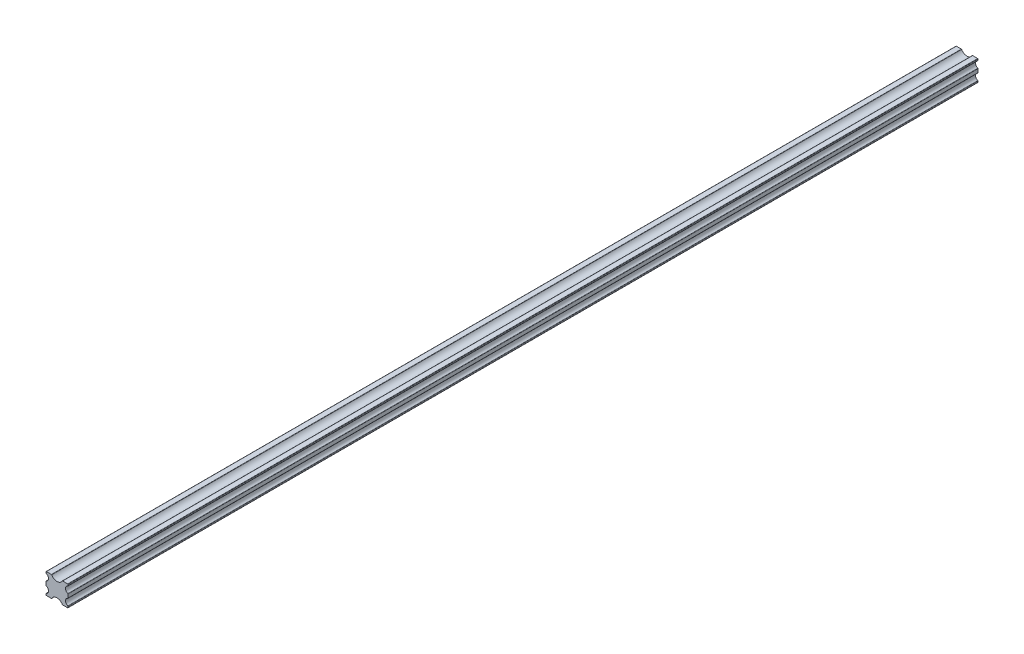
ISO-10303-21;
HEADER;
FILE_DESCRIPTION(('STEP AP214'),'2;1');
FILE_NAME('part.step','',(''),(''),'','','');
FILE_SCHEMA(('AUTOMOTIVE_DESIGN { 1 0 10303 214 1 1 1 1 }'));
ENDSEC;
DATA;
#1=APPLICATION_CONTEXT('core data for automotive mechanical design processes');
#2=APPLICATION_PROTOCOL_DEFINITION('international standard','automotive_design',2000,#1);
#3=PRODUCT_CONTEXT('',#1,'mechanical');
#4=PRODUCT('Part','Part','',(#3));
#5=PRODUCT_RELATED_PRODUCT_CATEGORY('part','',(#4));
#6=PRODUCT_DEFINITION_FORMATION('','',#4);
#7=PRODUCT_DEFINITION_CONTEXT('part definition',#1,'design');
#8=PRODUCT_DEFINITION('design','',#6,#7);
#9=PRODUCT_DEFINITION_SHAPE('','',#8);
#10=(LENGTH_UNIT() NAMED_UNIT(*) SI_UNIT(.MILLI.,.METRE.));
#11=(NAMED_UNIT(*) PLANE_ANGLE_UNIT() SI_UNIT($,.RADIAN.));
#12=(NAMED_UNIT(*) SI_UNIT($,.STERADIAN.) SOLID_ANGLE_UNIT());
#13=UNCERTAINTY_MEASURE_WITH_UNIT(LENGTH_MEASURE(1.E-05),#10,'distance_accuracy_value','');
#14=(GEOMETRIC_REPRESENTATION_CONTEXT(3) GLOBAL_UNCERTAINTY_ASSIGNED_CONTEXT((#13)) GLOBAL_UNIT_ASSIGNED_CONTEXT((#10,
#11,#12)) REPRESENTATION_CONTEXT('',''));
#15=CARTESIAN_POINT('',(0.,0.,0.));
#16=DIRECTION('',(0.,0.,1.));
#17=DIRECTION('',(1.,0.,0.));
#18=AXIS2_PLACEMENT_3D('',#15,#16,#17);
#19=CARTESIAN_POINT('',(6.05,-5.7,500.));
#20=DIRECTION('',(-1.,0.,0.));
#21=DIRECTION('',(0.,0.,1.));
#22=AXIS2_PLACEMENT_3D('',#19,#20,#21);
#23=PLANE('',#22);
#24=DIRECTION('',(0.,1.,0.));
#25=VECTOR('',#24,1.);
#26=CARTESIAN_POINT('',(6.05,-5.7,0.));
#27=LINE('',#26,#25);
#28=CARTESIAN_POINT('',(6.05,-5.5,0.));
#29=VERTEX_POINT('',#28);
#30=CARTESIAN_POINT('',(6.05,-4.90469816206834,0.));
#31=VERTEX_POINT('',#30);
#32=EDGE_CURVE('E299',#29,#31,#27,.T.);
#33=ORIENTED_EDGE('',*,*,#32,.T.);
#34=DIRECTION('',(0.,0.,1.));
#35=VECTOR('',#34,1.);
#36=CARTESIAN_POINT('',(6.05,-4.90469816206834,500.));
#37=LINE('',#36,#35);
#38=CARTESIAN_POINT('',(6.05,-4.90469816206834,500.));
#39=VERTEX_POINT('',#38);
#40=EDGE_CURVE('E441',#31,#39,#37,.T.);
#41=ORIENTED_EDGE('',*,*,#40,.T.);
#42=DIRECTION('',(0.,1.,0.));
#43=VECTOR('',#42,1.);
#44=CARTESIAN_POINT('',(6.05,-5.7,500.));
#45=LINE('',#44,#43);
#46=CARTESIAN_POINT('',(6.05,-5.5,500.));
#47=VERTEX_POINT('',#46);
#48=EDGE_CURVE('E543',#47,#39,#45,.T.);
#49=ORIENTED_EDGE('',*,*,#48,.F.);
#50=DIRECTION('',(0.,0.,-1.));
#51=VECTOR('',#50,1.);
#52=CARTESIAN_POINT('',(6.05,-5.5,500.));
#53=LINE('',#52,#51);
#54=EDGE_CURVE('E437',#47,#29,#53,.T.);
#55=ORIENTED_EDGE('',*,*,#54,.T.);
#56=EDGE_LOOP('',(#33,#41,#49,#55));
#57=FACE_BOUND('',#56,.T.);
#58=ADVANCED_FACE('F45',(#57),#23,.F.);
#59=CARTESIAN_POINT('',(6.05,-0.955634982021713,0.));
#60=VERTEX_POINT('',#59);
#61=CARTESIAN_POINT('',(6.05,0.955634982021713,0.));
#62=VERTEX_POINT('',#61);
#63=EDGE_CURVE('E301',#60,#62,#27,.T.);
#64=ORIENTED_EDGE('',*,*,#63,.T.);
#65=DIRECTION('',(0.,0.,1.));
#66=VECTOR('',#65,1.);
#67=CARTESIAN_POINT('',(6.05,0.955634982021713,500.));
#68=LINE('',#67,#66);
#69=CARTESIAN_POINT('',(6.05,0.955634982021713,500.));
#70=VERTEX_POINT('',#69);
#71=EDGE_CURVE('E427',#62,#70,#68,.T.);
#72=ORIENTED_EDGE('',*,*,#71,.T.);
#73=CARTESIAN_POINT('',(6.05,-0.955634982021713,500.));
#74=VERTEX_POINT('',#73);
#75=EDGE_CURVE('E545',#74,#70,#45,.T.);
#76=ORIENTED_EDGE('',*,*,#75,.F.);
#77=DIRECTION('',(0.,0.,1.));
#78=VECTOR('',#77,1.);
#79=CARTESIAN_POINT('',(6.05,-0.955634982021713,500.));
#80=LINE('',#79,#78);
#81=EDGE_CURVE('E423',#74,#60,#80,.F.);
#82=ORIENTED_EDGE('',*,*,#81,.T.);
#83=EDGE_LOOP('',(#64,#72,#76,#82));
#84=FACE_BOUND('',#83,.T.);
#85=ADVANCED_FACE('F601',(#84),#23,.F.);
#86=CARTESIAN_POINT('',(-6.05,5.7,500.));
#87=DIRECTION('',(0.,-1.,0.));
#88=DIRECTION('',(0.,0.,-1.));
#89=AXIS2_PLACEMENT_3D('',#86,#87,#88);
#90=PLANE('',#89);
#91=DIRECTION('',(-1.,0.,0.));
#92=VECTOR('',#91,1.);
#93=CARTESIAN_POINT('',(-6.05,5.7,500.));
#94=LINE('',#93,#92);
#95=CARTESIAN_POINT('',(5.85,5.7,500.));
#96=VERTEX_POINT('',#95);
#97=CARTESIAN_POINT('',(3.10554343070581,5.7,500.));
#98=VERTEX_POINT('',#97);
#99=EDGE_CURVE('E279',#96,#98,#94,.T.);
#100=ORIENTED_EDGE('',*,*,#99,.F.);
#101=DIRECTION('',(0.,0.,-1.));
#102=VECTOR('',#101,1.);
#103=CARTESIAN_POINT('',(5.85,5.7,500.));
#104=LINE('',#103,#102);
#105=CARTESIAN_POINT('',(5.85,5.7,0.));
#106=VERTEX_POINT('',#105);
#107=EDGE_CURVE('E261',#96,#106,#104,.T.);
#108=ORIENTED_EDGE('',*,*,#107,.T.);
#109=DIRECTION('',(-1.,0.,0.));
#110=VECTOR('',#109,1.);
#111=CARTESIAN_POINT('',(-6.05,5.7,0.));
#112=LINE('',#111,#110);
#113=CARTESIAN_POINT('',(3.10554343070581,5.7,0.));
#114=VERTEX_POINT('',#113);
#115=EDGE_CURVE('E276',#106,#114,#112,.T.);
#116=ORIENTED_EDGE('',*,*,#115,.T.);
#117=DIRECTION('',(0.,0.,1.));
#118=VECTOR('',#117,1.);
#119=CARTESIAN_POINT('',(3.10554343070581,5.7,500.));
#120=LINE('',#119,#118);
#121=EDGE_CURVE('E282',#114,#98,#120,.T.);
#122=ORIENTED_EDGE('',*,*,#121,.T.);
#123=EDGE_LOOP('',(#100,#108,#116,#122));
#124=FACE_BOUND('',#123,.T.);
#125=ADVANCED_FACE('F274',(#124),#90,.F.);
#126=CARTESIAN_POINT('',(-6.05,-5.7,500.));
#127=DIRECTION('',(1.,0.,0.));
#128=DIRECTION('',(0.,0.,-1.));
#129=AXIS2_PLACEMENT_3D('',#126,#127,#128);
#130=PLANE('',#129);
#131=DIRECTION('',(0.,-1.,0.));
#132=VECTOR('',#131,1.);
#133=CARTESIAN_POINT('',(-6.05,-5.7,0.));
#134=LINE('',#133,#132);
#135=CARTESIAN_POINT('',(-6.05,0.955634982021713,0.));
#136=VERTEX_POINT('',#135);
#137=CARTESIAN_POINT('',(-6.05,-0.955634982021713,0.));
#138=VERTEX_POINT('',#137);
#139=EDGE_CURVE('E295',#136,#138,#134,.T.);
#140=ORIENTED_EDGE('',*,*,#139,.T.);
#141=DIRECTION('',(0.,0.,1.));
#142=VECTOR('',#141,1.);
#143=CARTESIAN_POINT('',(-6.05,-0.955634982021713,500.));
#144=LINE('',#143,#142);
#145=CARTESIAN_POINT('',(-6.05,-0.955634982021713,500.));
#146=VERTEX_POINT('',#145);
#147=EDGE_CURVE('E495',#138,#146,#144,.T.);
#148=ORIENTED_EDGE('',*,*,#147,.T.);
#149=DIRECTION('',(0.,-1.,0.));
#150=VECTOR('',#149,1.);
#151=CARTESIAN_POINT('',(-6.05,-5.7,500.));
#152=LINE('',#151,#150);
#153=CARTESIAN_POINT('',(-6.05,0.955634982021713,500.));
#154=VERTEX_POINT('',#153);
#155=EDGE_CURVE('E529',#154,#146,#152,.T.);
#156=ORIENTED_EDGE('',*,*,#155,.F.);
#157=DIRECTION('',(0.,0.,1.));
#158=VECTOR('',#157,1.);
#159=CARTESIAN_POINT('',(-6.05,0.955634982021713,500.));
#160=LINE('',#159,#158);
#161=EDGE_CURVE('E491',#154,#136,#160,.F.);
#162=ORIENTED_EDGE('',*,*,#161,.T.);
#163=EDGE_LOOP('',(#140,#148,#156,#162));
#164=FACE_BOUND('',#163,.T.);
#165=ADVANCED_FACE('F635',(#164),#130,.F.);
#166=CARTESIAN_POINT('',(-6.05,5.5,0.));
#167=VERTEX_POINT('',#166);
#168=CARTESIAN_POINT('',(-6.05,4.90469816206834,0.));
#169=VERTEX_POINT('',#168);
#170=EDGE_CURVE('E297',#167,#169,#134,.T.);
#171=ORIENTED_EDGE('',*,*,#170,.T.);
#172=DIRECTION('',(0.,0.,1.));
#173=VECTOR('',#172,1.);
#174=CARTESIAN_POINT('',(-6.05,4.90469816206834,500.));
#175=LINE('',#174,#173);
#176=CARTESIAN_POINT('',(-6.05,4.90469816206834,500.));
#177=VERTEX_POINT('',#176);
#178=EDGE_CURVE('E11',#169,#177,#175,.T.);
#179=ORIENTED_EDGE('',*,*,#178,.T.);
#180=CARTESIAN_POINT('',(-6.05,5.5,500.));
#181=VERTEX_POINT('',#180);
#182=EDGE_CURVE('E513',#181,#177,#152,.T.);
#183=ORIENTED_EDGE('',*,*,#182,.F.);
#184=DIRECTION('',(0.,0.,-1.));
#185=VECTOR('',#184,1.);
#186=CARTESIAN_POINT('',(-6.05,5.5,500.));
#187=LINE('',#186,#185);
#188=EDGE_CURVE('E54',#181,#167,#187,.T.);
#189=ORIENTED_EDGE('',*,*,#188,.T.);
#190=EDGE_LOOP('',(#171,#179,#183,#189));
#191=FACE_BOUND('',#190,.T.);
#192=ADVANCED_FACE('F510',(#191),#130,.F.);
#193=CARTESIAN_POINT('',(-6.05,-5.7,500.));
#194=DIRECTION('',(0.,1.,0.));
#195=DIRECTION('',(0.,0.,1.));
#196=AXIS2_PLACEMENT_3D('',#193,#194,#195);
#197=PLANE('',#196);
#198=DIRECTION('',(1.,0.,0.));
#199=VECTOR('',#198,1.);
#200=CARTESIAN_POINT('',(-6.05,-5.7,0.));
#201=LINE('',#200,#199);
#202=CARTESIAN_POINT('',(-5.85,-5.7,0.));
#203=VERTEX_POINT('',#202);
#204=CARTESIAN_POINT('',(-3.10554343070581,-5.7,0.));
#205=VERTEX_POINT('',#204);
#206=EDGE_CURVE('E307',#203,#205,#201,.T.);
#207=ORIENTED_EDGE('',*,*,#206,.T.);
#208=DIRECTION('',(0.,0.,1.));
#209=VECTOR('',#208,1.);
#210=CARTESIAN_POINT('',(-3.10554343070581,-5.7,500.));
#211=LINE('',#210,#209);
#212=CARTESIAN_POINT('',(-3.10554343070581,-5.7,500.));
#213=VERTEX_POINT('',#212);
#214=EDGE_CURVE('E474',#205,#213,#211,.T.);
#215=ORIENTED_EDGE('',*,*,#214,.T.);
#216=DIRECTION('',(1.,0.,0.));
#217=VECTOR('',#216,1.);
#218=CARTESIAN_POINT('',(-6.05,-5.7,500.));
#219=LINE('',#218,#217);
#220=CARTESIAN_POINT('',(-5.85,-5.7,500.));
#221=VERTEX_POINT('',#220);
#222=EDGE_CURVE('E317',#221,#213,#219,.T.);
#223=ORIENTED_EDGE('',*,*,#222,.F.);
#224=DIRECTION('',(0.,0.,-1.));
#225=VECTOR('',#224,1.);
#226=CARTESIAN_POINT('',(-5.85,-5.7,500.));
#227=LINE('',#226,#225);
#228=EDGE_CURVE('E470',#221,#203,#227,.T.);
#229=ORIENTED_EDGE('',*,*,#228,.T.);
#230=EDGE_LOOP('',(#207,#215,#223,#229));
#231=FACE_BOUND('',#230,.T.);
#232=ADVANCED_FACE('F661',(#231),#197,.F.);
#233=CARTESIAN_POINT('',(6.05,4.90469816206834,0.));
#234=VERTEX_POINT('',#233);
#235=CARTESIAN_POINT('',(6.05,5.5,0.));
#236=VERTEX_POINT('',#235);
#237=EDGE_CURVE('E557',#234,#236,#27,.T.);
#238=ORIENTED_EDGE('',*,*,#237,.T.);
#239=DIRECTION('',(0.,0.,-1.));
#240=VECTOR('',#239,1.);
#241=CARTESIAN_POINT('',(6.05,5.5,500.));
#242=LINE('',#241,#240);
#243=CARTESIAN_POINT('',(6.05,5.5,500.));
#244=VERTEX_POINT('',#243);
#245=EDGE_CURVE('E262',#236,#244,#242,.F.);
#246=ORIENTED_EDGE('',*,*,#245,.T.);
#247=CARTESIAN_POINT('',(6.05,4.90469816206834,500.));
#248=VERTEX_POINT('',#247);
#249=EDGE_CURVE('E311',#248,#244,#45,.T.);
#250=ORIENTED_EDGE('',*,*,#249,.F.);
#251=DIRECTION('',(0.,0.,1.));
#252=VECTOR('',#251,1.);
#253=CARTESIAN_POINT('',(6.05,4.90469816206834,500.));
#254=LINE('',#253,#252);
#255=EDGE_CURVE('E268',#248,#234,#254,.F.);
#256=ORIENTED_EDGE('',*,*,#255,.T.);
#257=EDGE_LOOP('',(#238,#246,#250,#256));
#258=FACE_BOUND('',#257,.T.);
#259=ADVANCED_FACE('F609',(#258),#23,.F.);
#260=CARTESIAN_POINT('',(-3.10554343070581,5.7,500.));
#261=VERTEX_POINT('',#260);
#262=CARTESIAN_POINT('',(-5.85,5.7,500.));
#263=VERTEX_POINT('',#262);
#264=EDGE_CURVE('E541',#261,#263,#94,.T.);
#265=ORIENTED_EDGE('',*,*,#264,.F.);
#266=DIRECTION('',(0.,0.,1.));
#267=VECTOR('',#266,1.);
#268=CARTESIAN_POINT('',(-3.10554343070581,5.7,500.));
#269=LINE('',#268,#267);
#270=CARTESIAN_POINT('',(-3.10554343070581,5.7,0.));
#271=VERTEX_POINT('',#270);
#272=EDGE_CURVE('E460',#261,#271,#269,.F.);
#273=ORIENTED_EDGE('',*,*,#272,.T.);
#274=CARTESIAN_POINT('',(-5.85,5.7,0.));
#275=VERTEX_POINT('',#274);
#276=EDGE_CURVE('E290',#271,#275,#112,.T.);
#277=ORIENTED_EDGE('',*,*,#276,.T.);
#278=DIRECTION('',(0.,0.,-1.));
#279=VECTOR('',#278,1.);
#280=CARTESIAN_POINT('',(-5.85,5.7,500.));
#281=LINE('',#280,#279);
#282=EDGE_CURVE('E457',#275,#263,#281,.F.);
#283=ORIENTED_EDGE('',*,*,#282,.T.);
#284=EDGE_LOOP('',(#265,#273,#277,#283));
#285=FACE_BOUND('',#284,.T.);
#286=ADVANCED_FACE('F694',(#285),#90,.F.);
#287=CARTESIAN_POINT('',(-6.05,-4.90469816206834,0.));
#288=VERTEX_POINT('',#287);
#289=CARTESIAN_POINT('',(-6.05,-5.5,0.));
#290=VERTEX_POINT('',#289);
#291=EDGE_CURVE('E289',#288,#290,#134,.T.);
#292=ORIENTED_EDGE('',*,*,#291,.T.);
#293=DIRECTION('',(0.,0.,-1.));
#294=VECTOR('',#293,1.);
#295=CARTESIAN_POINT('',(-6.05,-5.5,500.));
#296=LINE('',#295,#294);
#297=CARTESIAN_POINT('',(-6.05,-5.5,500.));
#298=VERTEX_POINT('',#297);
#299=EDGE_CURVE('E482',#290,#298,#296,.F.);
#300=ORIENTED_EDGE('',*,*,#299,.T.);
#301=CARTESIAN_POINT('',(-6.05,-4.90469816206834,500.));
#302=VERTEX_POINT('',#301);
#303=EDGE_CURVE('E531',#302,#298,#152,.T.);
#304=ORIENTED_EDGE('',*,*,#303,.F.);
#305=DIRECTION('',(0.,0.,1.));
#306=VECTOR('',#305,1.);
#307=CARTESIAN_POINT('',(-6.05,-4.90469816206834,500.));
#308=LINE('',#307,#306);
#309=EDGE_CURVE('E478',#302,#288,#308,.F.);
#310=ORIENTED_EDGE('',*,*,#309,.T.);
#311=EDGE_LOOP('',(#292,#300,#304,#310));
#312=FACE_BOUND('',#311,.T.);
#313=ADVANCED_FACE('F652',(#312),#130,.F.);
#314=CARTESIAN_POINT('',(3.10554343070581,-5.7,0.));
#315=VERTEX_POINT('',#314);
#316=CARTESIAN_POINT('',(5.85,-5.7,0.));
#317=VERTEX_POINT('',#316);
#318=EDGE_CURVE('E306',#315,#317,#201,.T.);
#319=ORIENTED_EDGE('',*,*,#318,.T.);
#320=DIRECTION('',(0.,0.,-1.));
#321=VECTOR('',#320,1.);
#322=CARTESIAN_POINT('',(5.85,-5.7,500.));
#323=LINE('',#322,#321);
#324=CARTESIAN_POINT('',(5.85,-5.7,500.));
#325=VERTEX_POINT('',#324);
#326=EDGE_CURVE('E61',#317,#325,#323,.F.);
#327=ORIENTED_EDGE('',*,*,#326,.T.);
#328=CARTESIAN_POINT('',(3.10554343070581,-5.7,500.));
#329=VERTEX_POINT('',#328);
#330=EDGE_CURVE('E528',#329,#325,#219,.T.);
#331=ORIENTED_EDGE('',*,*,#330,.F.);
#332=DIRECTION('',(0.,0.,1.));
#333=VECTOR('',#332,1.);
#334=CARTESIAN_POINT('',(3.10554343070581,-5.7,500.));
#335=LINE('',#334,#333);
#336=EDGE_CURVE('E445',#329,#315,#335,.F.);
#337=ORIENTED_EDGE('',*,*,#336,.T.);
#338=EDGE_LOOP('',(#319,#327,#331,#337));
#339=FACE_BOUND('',#338,.T.);
#340=ADVANCED_FACE('F627',(#339),#197,.F.);
#341=CARTESIAN_POINT('',(0.,0.,500.));
#342=DIRECTION('',(0.,0.,-1.));
#343=DIRECTION('',(-1.,0.,0.));
#344=AXIS2_PLACEMENT_3D('',#341,#342,#343);
#345=PLANE('',#344);
#346=ORIENTED_EDGE('',*,*,#249,.T.);
#347=CARTESIAN_POINT('',(5.85,5.5,500.));
#348=DIRECTION('',(0.,0.,-1.));
#349=DIRECTION('',(-1.,0.,0.));
#350=AXIS2_PLACEMENT_3D('',#347,#348,#349);
#351=CIRCLE('',#350,0.2);
#352=EDGE_CURVE('E414',#244,#96,#351,.F.);
#353=ORIENTED_EDGE('',*,*,#352,.T.);
#354=ORIENTED_EDGE('',*,*,#99,.T.);
#355=CARTESIAN_POINT('',(3.10554343070581,5.5,500.));
#356=DIRECTION('',(0.,0.,-1.));
#357=DIRECTION('',(-1.,0.,0.));
#358=AXIS2_PLACEMENT_3D('',#355,#356,#357);
#359=CIRCLE('',#358,0.2);
#360=CARTESIAN_POINT('',(2.93200090873287,5.59941324392288,500.));
#361=VERTEX_POINT('',#360);
#362=EDGE_CURVE('E396',#98,#361,#359,.F.);
#363=ORIENTED_EDGE('',*,*,#362,.T.);
#364=CARTESIAN_POINT('',(0.,7.279,500.));
#365=DIRECTION('',(0.,0.,1.));
#366=DIRECTION('',(1.,0.,0.));
#367=AXIS2_PLACEMENT_3D('',#364,#365,#366);
#368=CIRCLE('',#367,3.379);
#369=CARTESIAN_POINT('',(-2.93200090873287,5.59941324392288,500.));
#370=VERTEX_POINT('',#369);
#371=EDGE_CURVE('E549',#370,#361,#368,.T.);
#372=ORIENTED_EDGE('',*,*,#371,.F.);
#373=CARTESIAN_POINT('',(-3.10554343070581,5.5,500.));
#374=DIRECTION('',(0.,0.,-1.));
#375=DIRECTION('',(-1.,0.,0.));
#376=AXIS2_PLACEMENT_3D('',#373,#374,#375);
#377=CIRCLE('',#376,0.2);
#378=EDGE_CURVE('E393',#370,#261,#377,.F.);
#379=ORIENTED_EDGE('',*,*,#378,.T.);
#380=ORIENTED_EDGE('',*,*,#264,.T.);
#381=CARTESIAN_POINT('',(-5.85,5.5,500.));
#382=DIRECTION('',(0.,0.,-1.));
#383=DIRECTION('',(-1.,0.,0.));
#384=AXIS2_PLACEMENT_3D('',#381,#382,#383);
#385=CIRCLE('',#384,0.2);
#386=EDGE_CURVE('E370',#263,#181,#385,.F.);
#387=ORIENTED_EDGE('',*,*,#386,.T.);
#388=ORIENTED_EDGE('',*,*,#182,.T.);
#389=CARTESIAN_POINT('',(-5.85,4.90469816206834,500.));
#390=DIRECTION('',(0.,0.,-1.));
#391=DIRECTION('',(-1.,0.,0.));
#392=AXIS2_PLACEMENT_3D('',#389,#390,#391);
#393=CIRCLE('',#392,0.2);
#394=CARTESIAN_POINT('',(-5.91809523809524,4.71664753444707,500.));
#395=VERTEX_POINT('',#394);
#396=EDGE_CURVE('E373',#177,#395,#393,.F.);
#397=ORIENTED_EDGE('',*,*,#396,.T.);
#398=CARTESIAN_POINT('',(-6.565,2.93016657204503,500.));
#399=DIRECTION('',(0.,0.,1.));
#400=DIRECTION('',(1.,0.,0.));
#401=AXIS2_PLACEMENT_3D('',#398,#399,#400);
#402=CIRCLE('',#401,1.9);
#403=CARTESIAN_POINT('',(-5.91809523809524,1.14368560964298,500.));
#404=VERTEX_POINT('',#403);
#405=EDGE_CURVE('E558',#404,#395,#402,.T.);
#406=ORIENTED_EDGE('',*,*,#405,.F.);
#407=CARTESIAN_POINT('',(-5.85,0.955634982021713,500.));
#408=DIRECTION('',(0.,0.,-1.));
#409=DIRECTION('',(-1.,0.,0.));
#410=AXIS2_PLACEMENT_3D('',#407,#408,#409);
#411=CIRCLE('',#410,0.2);
#412=EDGE_CURVE('E376',#404,#154,#411,.F.);
#413=ORIENTED_EDGE('',*,*,#412,.T.);
#414=ORIENTED_EDGE('',*,*,#155,.T.);
#415=CARTESIAN_POINT('',(-5.85,-0.955634982021713,500.));
#416=DIRECTION('',(0.,0.,-1.));
#417=DIRECTION('',(-1.,0.,0.));
#418=AXIS2_PLACEMENT_3D('',#415,#416,#417);
#419=CIRCLE('',#418,0.2);
#420=CARTESIAN_POINT('',(-5.91809523809524,-1.14368560964298,500.));
#421=VERTEX_POINT('',#420);
#422=EDGE_CURVE('E379',#146,#421,#419,.F.);
#423=ORIENTED_EDGE('',*,*,#422,.T.);
#424=CARTESIAN_POINT('',(-6.565,-2.93016657204503,500.));
#425=DIRECTION('',(0.,0.,1.));
#426=DIRECTION('',(-1.,0.,0.));
#427=AXIS2_PLACEMENT_3D('',#424,#425,#426);
#428=CIRCLE('',#427,1.9);
#429=CARTESIAN_POINT('',(-5.91809523809524,-4.71664753444707,500.));
#430=VERTEX_POINT('',#429);
#431=EDGE_CURVE('E562',#430,#421,#428,.T.);
#432=ORIENTED_EDGE('',*,*,#431,.F.);
#433=CARTESIAN_POINT('',(-5.85,-4.90469816206834,500.));
#434=DIRECTION('',(0.,0.,-1.));
#435=DIRECTION('',(-1.,0.,0.));
#436=AXIS2_PLACEMENT_3D('',#433,#434,#435);
#437=CIRCLE('',#436,0.2);
#438=EDGE_CURVE('E382',#430,#302,#437,.F.);
#439=ORIENTED_EDGE('',*,*,#438,.T.);
#440=ORIENTED_EDGE('',*,*,#303,.T.);
#441=CARTESIAN_POINT('',(-5.85,-5.5,500.));
#442=DIRECTION('',(0.,0.,-1.));
#443=DIRECTION('',(-1.,0.,0.));
#444=AXIS2_PLACEMENT_3D('',#441,#442,#443);
#445=CIRCLE('',#444,0.2);
#446=EDGE_CURVE('E385',#298,#221,#445,.F.);
#447=ORIENTED_EDGE('',*,*,#446,.T.);
#448=ORIENTED_EDGE('',*,*,#222,.T.);
#449=CARTESIAN_POINT('',(-3.10554343070581,-5.5,500.));
#450=DIRECTION('',(0.,0.,-1.));
#451=DIRECTION('',(-1.,0.,0.));
#452=AXIS2_PLACEMENT_3D('',#449,#450,#451);
#453=CIRCLE('',#452,0.2);
#454=CARTESIAN_POINT('',(-2.93200090873287,-5.59941324392288,500.));
#455=VERTEX_POINT('',#454);
#456=EDGE_CURVE('E388',#213,#455,#453,.F.);
#457=ORIENTED_EDGE('',*,*,#456,.T.);
#458=CARTESIAN_POINT('',(0.,-7.279,500.));
#459=DIRECTION('',(0.,0.,1.));
#460=DIRECTION('',(-1.,0.,0.));
#461=AXIS2_PLACEMENT_3D('',#458,#459,#460);
#462=CIRCLE('',#461,3.379);
#463=CARTESIAN_POINT('',(2.93200090873287,-5.59941324392288,500.));
#464=VERTEX_POINT('',#463);
#465=EDGE_CURVE('E554',#464,#455,#462,.T.);
#466=ORIENTED_EDGE('',*,*,#465,.F.);
#467=CARTESIAN_POINT('',(3.10554343070581,-5.5,500.));
#468=DIRECTION('',(0.,0.,-1.));
#469=DIRECTION('',(-1.,0.,0.));
#470=AXIS2_PLACEMENT_3D('',#467,#468,#469);
#471=CIRCLE('',#470,0.2);
#472=EDGE_CURVE('E68',#464,#329,#471,.F.);
#473=ORIENTED_EDGE('',*,*,#472,.T.);
#474=ORIENTED_EDGE('',*,*,#330,.T.);
#475=CARTESIAN_POINT('',(5.85,-5.5,500.));
#476=DIRECTION('',(0.,0.,-1.));
#477=DIRECTION('',(-1.,0.,0.));
#478=AXIS2_PLACEMENT_3D('',#475,#476,#477);
#479=CIRCLE('',#478,0.2);
#480=EDGE_CURVE('E399',#325,#47,#479,.F.);
#481=ORIENTED_EDGE('',*,*,#480,.T.);
#482=ORIENTED_EDGE('',*,*,#48,.T.);
#483=CARTESIAN_POINT('',(5.85,-4.90469816206834,500.));
#484=DIRECTION('',(0.,0.,-1.));
#485=DIRECTION('',(-1.,0.,0.));
#486=AXIS2_PLACEMENT_3D('',#483,#484,#485);
#487=CIRCLE('',#486,0.2);
#488=CARTESIAN_POINT('',(5.91809523809524,-4.71664753444707,500.));
#489=VERTEX_POINT('',#488);
#490=EDGE_CURVE('E402',#39,#489,#487,.F.);
#491=ORIENTED_EDGE('',*,*,#490,.T.);
#492=CARTESIAN_POINT('',(6.565,-2.93016657204503,500.));
#493=DIRECTION('',(0.,0.,1.));
#494=DIRECTION('',(1.,0.,0.));
#495=AXIS2_PLACEMENT_3D('',#492,#493,#494);
#496=CIRCLE('',#495,1.9);
#497=CARTESIAN_POINT('',(5.91809523809524,-1.14368560964298,500.));
#498=VERTEX_POINT('',#497);
#499=EDGE_CURVE('E573',#498,#489,#496,.T.);
#500=ORIENTED_EDGE('',*,*,#499,.F.);
#501=CARTESIAN_POINT('',(5.85,-0.955634982021713,500.));
#502=DIRECTION('',(0.,0.,-1.));
#503=DIRECTION('',(-1.,0.,0.));
#504=AXIS2_PLACEMENT_3D('',#501,#502,#503);
#505=CIRCLE('',#504,0.2);
#506=EDGE_CURVE('E405',#498,#74,#505,.F.);
#507=ORIENTED_EDGE('',*,*,#506,.T.);
#508=ORIENTED_EDGE('',*,*,#75,.T.);
#509=CARTESIAN_POINT('',(5.85,0.955634982021713,500.));
#510=DIRECTION('',(0.,0.,-1.));
#511=DIRECTION('',(-1.,0.,0.));
#512=AXIS2_PLACEMENT_3D('',#509,#510,#511);
#513=CIRCLE('',#512,0.2);
#514=CARTESIAN_POINT('',(5.91809523809524,1.14368560964298,500.));
#515=VERTEX_POINT('',#514);
#516=EDGE_CURVE('E408',#70,#515,#513,.F.);
#517=ORIENTED_EDGE('',*,*,#516,.T.);
#518=CARTESIAN_POINT('',(6.565,2.93016657204503,500.));
#519=DIRECTION('',(0.,0.,1.));
#520=DIRECTION('',(-1.,0.,0.));
#521=AXIS2_PLACEMENT_3D('',#518,#519,#520);
#522=CIRCLE('',#521,1.9);
#523=CARTESIAN_POINT('',(5.91809523809524,4.71664753444707,500.));
#524=VERTEX_POINT('',#523);
#525=EDGE_CURVE('E574',#524,#515,#522,.T.);
#526=ORIENTED_EDGE('',*,*,#525,.F.);
#527=CARTESIAN_POINT('',(5.85,4.90469816206834,500.));
#528=DIRECTION('',(0.,0.,-1.));
#529=DIRECTION('',(-1.,0.,0.));
#530=AXIS2_PLACEMENT_3D('',#527,#528,#529);
#531=CIRCLE('',#530,0.2);
#532=EDGE_CURVE('E411',#524,#248,#531,.F.);
#533=ORIENTED_EDGE('',*,*,#532,.T.);
#534=EDGE_LOOP('',(#346,#353,#354,#363,#372,#379,#380,#387,#388,#397,#406,#413,#414,#423,#432,
#439,#440,#447,#448,#457,#466,#473,#474,#481,#482,#491,#500,#507,#508,#517,#526,#533));
#535=FACE_BOUND('',#534,.T.);
#536=ADVANCED_FACE('F523',(#535),#345,.F.);
#537=CARTESIAN_POINT('',(0.,0.,0.));
#538=DIRECTION('',(0.,0.,-1.));
#539=DIRECTION('',(-1.,0.,0.));
#540=AXIS2_PLACEMENT_3D('',#537,#538,#539);
#541=PLANE('',#540);
#542=ORIENTED_EDGE('',*,*,#115,.F.);
#543=CARTESIAN_POINT('',(5.85,5.5,0.));
#544=DIRECTION('',(0.,0.,-1.));
#545=DIRECTION('',(-1.,0.,0.));
#546=AXIS2_PLACEMENT_3D('',#543,#544,#545);
#547=CIRCLE('',#546,0.2);
#548=EDGE_CURVE('E257',#106,#236,#547,.T.);
#549=ORIENTED_EDGE('',*,*,#548,.T.);
#550=ORIENTED_EDGE('',*,*,#237,.F.);
#551=CARTESIAN_POINT('',(5.85,4.90469816206834,0.));
#552=DIRECTION('',(0.,0.,-1.));
#553=DIRECTION('',(-1.,0.,0.));
#554=AXIS2_PLACEMENT_3D('',#551,#552,#553);
#555=CIRCLE('',#554,0.2);
#556=CARTESIAN_POINT('',(5.91809523809524,4.71664753444707,0.));
#557=VERTEX_POINT('',#556);
#558=EDGE_CURVE('E269',#234,#557,#555,.T.);
#559=ORIENTED_EDGE('',*,*,#558,.T.);
#560=CARTESIAN_POINT('',(6.565,2.93016657204503,0.));
#561=DIRECTION('',(0.,0.,-1.));
#562=DIRECTION('',(-1.,0.,0.));
#563=AXIS2_PLACEMENT_3D('',#560,#561,#562);
#564=CIRCLE('',#563,1.9);
#565=CARTESIAN_POINT('',(5.91809523809524,1.14368560964298,0.));
#566=VERTEX_POINT('',#565);
#567=EDGE_CURVE('E312',#566,#557,#564,.T.);
#568=ORIENTED_EDGE('',*,*,#567,.F.);
#569=CARTESIAN_POINT('',(5.85,0.955634982021713,0.));
#570=DIRECTION('',(0.,0.,-1.));
#571=DIRECTION('',(-1.,0.,0.));
#572=AXIS2_PLACEMENT_3D('',#569,#570,#571);
#573=CIRCLE('',#572,0.2);
#574=EDGE_CURVE('E360',#566,#62,#573,.T.);
#575=ORIENTED_EDGE('',*,*,#574,.T.);
#576=ORIENTED_EDGE('',*,*,#63,.F.);
#577=CARTESIAN_POINT('',(5.85,-0.955634982021713,0.));
#578=DIRECTION('',(0.,0.,-1.));
#579=DIRECTION('',(-1.,0.,0.));
#580=AXIS2_PLACEMENT_3D('',#577,#578,#579);
#581=CIRCLE('',#580,0.2);
#582=CARTESIAN_POINT('',(5.91809523809524,-1.14368560964298,0.));
#583=VERTEX_POINT('',#582);
#584=EDGE_CURVE('E357',#60,#583,#581,.T.);
#585=ORIENTED_EDGE('',*,*,#584,.T.);
#586=CARTESIAN_POINT('',(6.565,-2.93016657204503,0.));
#587=DIRECTION('',(0.,0.,1.));
#588=DIRECTION('',(1.,0.,0.));
#589=AXIS2_PLACEMENT_3D('',#586,#587,#588);
#590=CIRCLE('',#589,1.9);
#591=CARTESIAN_POINT('',(5.91809523809524,-4.71664753444707,0.));
#592=VERTEX_POINT('',#591);
#593=EDGE_CURVE('E569',#583,#592,#590,.T.);
#594=ORIENTED_EDGE('',*,*,#593,.T.);
#595=CARTESIAN_POINT('',(5.85,-4.90469816206834,0.));
#596=DIRECTION('',(0.,0.,-1.));
#597=DIRECTION('',(-1.,0.,0.));
#598=AXIS2_PLACEMENT_3D('',#595,#596,#597);
#599=CIRCLE('',#598,0.2);
#600=EDGE_CURVE('E354',#592,#31,#599,.T.);
#601=ORIENTED_EDGE('',*,*,#600,.T.);
#602=ORIENTED_EDGE('',*,*,#32,.F.);
#603=CARTESIAN_POINT('',(5.85,-5.5,0.));
#604=DIRECTION('',(0.,0.,-1.));
#605=DIRECTION('',(-1.,0.,0.));
#606=AXIS2_PLACEMENT_3D('',#603,#604,#605);
#607=CIRCLE('',#606,0.2);
#608=EDGE_CURVE('E351',#29,#317,#607,.T.);
#609=ORIENTED_EDGE('',*,*,#608,.T.);
#610=ORIENTED_EDGE('',*,*,#318,.F.);
#611=CARTESIAN_POINT('',(3.10554343070581,-5.5,0.));
#612=DIRECTION('',(0.,0.,-1.));
#613=DIRECTION('',(-1.,0.,0.));
#614=AXIS2_PLACEMENT_3D('',#611,#612,#613);
#615=CIRCLE('',#614,0.2);
#616=CARTESIAN_POINT('',(2.93200090873287,-5.59941324392288,0.));
#617=VERTEX_POINT('',#616);
#618=EDGE_CURVE('E343',#315,#617,#615,.T.);
#619=ORIENTED_EDGE('',*,*,#618,.T.);
#620=CARTESIAN_POINT('',(0.,-7.279,0.));
#621=DIRECTION('',(0.,0.,1.));
#622=DIRECTION('',(-1.,0.,0.));
#623=AXIS2_PLACEMENT_3D('',#620,#621,#622);
#624=CIRCLE('',#623,3.379);
#625=CARTESIAN_POINT('',(-2.93200090873287,-5.59941324392288,0.));
#626=VERTEX_POINT('',#625);
#627=EDGE_CURVE('E561',#617,#626,#624,.T.);
#628=ORIENTED_EDGE('',*,*,#627,.T.);
#629=CARTESIAN_POINT('',(-3.10554343070581,-5.5,0.));
#630=DIRECTION('',(0.,0.,-1.));
#631=DIRECTION('',(-1.,0.,0.));
#632=AXIS2_PLACEMENT_3D('',#629,#630,#631);
#633=CIRCLE('',#632,0.2);
#634=EDGE_CURVE('E340',#626,#205,#633,.T.);
#635=ORIENTED_EDGE('',*,*,#634,.T.);
#636=ORIENTED_EDGE('',*,*,#206,.F.);
#637=CARTESIAN_POINT('',(-5.85,-5.5,0.));
#638=DIRECTION('',(0.,0.,-1.));
#639=DIRECTION('',(-1.,0.,0.));
#640=AXIS2_PLACEMENT_3D('',#637,#638,#639);
#641=CIRCLE('',#640,0.2);
#642=EDGE_CURVE('E337',#203,#290,#641,.T.);
#643=ORIENTED_EDGE('',*,*,#642,.T.);
#644=ORIENTED_EDGE('',*,*,#291,.F.);
#645=CARTESIAN_POINT('',(-5.85,-4.90469816206834,0.));
#646=DIRECTION('',(0.,0.,-1.));
#647=DIRECTION('',(-1.,0.,0.));
#648=AXIS2_PLACEMENT_3D('',#645,#646,#647);
#649=CIRCLE('',#648,0.2);
#650=CARTESIAN_POINT('',(-5.91809523809524,-4.71664753444707,0.));
#651=VERTEX_POINT('',#650);
#652=EDGE_CURVE('E334',#288,#651,#649,.T.);
#653=ORIENTED_EDGE('',*,*,#652,.T.);
#654=CARTESIAN_POINT('',(-6.565,-2.93016657204503,0.));
#655=DIRECTION('',(0.,0.,1.));
#656=DIRECTION('',(-1.,0.,0.));
#657=AXIS2_PLACEMENT_3D('',#654,#655,#656);
#658=CIRCLE('',#657,1.9);
#659=CARTESIAN_POINT('',(-5.91809523809524,-1.14368560964298,0.));
#660=VERTEX_POINT('',#659);
#661=EDGE_CURVE('E578',#651,#660,#658,.T.);
#662=ORIENTED_EDGE('',*,*,#661,.T.);
#663=CARTESIAN_POINT('',(-5.85,-0.955634982021713,0.));
#664=DIRECTION('',(0.,0.,-1.));
#665=DIRECTION('',(-1.,0.,0.));
#666=AXIS2_PLACEMENT_3D('',#663,#664,#665);
#667=CIRCLE('',#666,0.2);
#668=EDGE_CURVE('E331',#660,#138,#667,.T.);
#669=ORIENTED_EDGE('',*,*,#668,.T.);
#670=ORIENTED_EDGE('',*,*,#139,.F.);
#671=CARTESIAN_POINT('',(-5.85,0.955634982021713,0.));
#672=DIRECTION('',(0.,0.,-1.));
#673=DIRECTION('',(-1.,0.,0.));
#674=AXIS2_PLACEMENT_3D('',#671,#672,#673);
#675=CIRCLE('',#674,0.2);
#676=CARTESIAN_POINT('',(-5.91809523809524,1.14368560964298,0.));
#677=VERTEX_POINT('',#676);
#678=EDGE_CURVE('E328',#136,#677,#675,.T.);
#679=ORIENTED_EDGE('',*,*,#678,.T.);
#680=CARTESIAN_POINT('',(-6.565,2.93016657204503,0.));
#681=DIRECTION('',(0.,0.,-1.));
#682=DIRECTION('',(-1.,0.,0.));
#683=AXIS2_PLACEMENT_3D('',#680,#681,#682);
#684=CIRCLE('',#683,1.9);
#685=CARTESIAN_POINT('',(-5.91809523809524,4.71664753444707,0.));
#686=VERTEX_POINT('',#685);
#687=EDGE_CURVE('E316',#686,#677,#684,.T.);
#688=ORIENTED_EDGE('',*,*,#687,.F.);
#689=CARTESIAN_POINT('',(-5.85,4.90469816206834,0.));
#690=DIRECTION('',(0.,0.,-1.));
#691=DIRECTION('',(-1.,0.,0.));
#692=AXIS2_PLACEMENT_3D('',#689,#690,#691);
#693=CIRCLE('',#692,0.2);
#694=EDGE_CURVE('E325',#686,#169,#693,.T.);
#695=ORIENTED_EDGE('',*,*,#694,.T.);
#696=ORIENTED_EDGE('',*,*,#170,.F.);
#697=CARTESIAN_POINT('',(-5.85,5.5,0.));
#698=DIRECTION('',(0.,0.,-1.));
#699=DIRECTION('',(-1.,0.,0.));
#700=AXIS2_PLACEMENT_3D('',#697,#698,#699);
#701=CIRCLE('',#700,0.2);
#702=EDGE_CURVE('E281',#167,#275,#701,.T.);
#703=ORIENTED_EDGE('',*,*,#702,.T.);
#704=ORIENTED_EDGE('',*,*,#276,.F.);
#705=CARTESIAN_POINT('',(-3.10554343070581,5.5,0.));
#706=DIRECTION('',(0.,0.,-1.));
#707=DIRECTION('',(-1.,0.,0.));
#708=AXIS2_PLACEMENT_3D('',#705,#706,#707);
#709=CIRCLE('',#708,0.2);
#710=CARTESIAN_POINT('',(-2.93200090873287,5.59941324392288,0.));
#711=VERTEX_POINT('',#710);
#712=EDGE_CURVE('E346',#271,#711,#709,.T.);
#713=ORIENTED_EDGE('',*,*,#712,.T.);
#714=CARTESIAN_POINT('',(0.,7.279,0.));
#715=DIRECTION('',(0.,0.,1.));
#716=DIRECTION('',(1.,0.,0.));
#717=AXIS2_PLACEMENT_3D('',#714,#715,#716);
#718=CIRCLE('',#717,3.379);
#719=CARTESIAN_POINT('',(2.93200090873287,5.59941324392288,0.));
#720=VERTEX_POINT('',#719);
#721=EDGE_CURVE('E553',#711,#720,#718,.T.);
#722=ORIENTED_EDGE('',*,*,#721,.T.);
#723=CARTESIAN_POINT('',(3.10554343070581,5.5,0.));
#724=DIRECTION('',(0.,0.,-1.));
#725=DIRECTION('',(-1.,0.,0.));
#726=AXIS2_PLACEMENT_3D('',#723,#724,#725);
#727=CIRCLE('',#726,0.2);
#728=EDGE_CURVE('E287',#720,#114,#727,.T.);
#729=ORIENTED_EDGE('',*,*,#728,.T.);
#730=EDGE_LOOP('',(#542,#549,#550,#559,#568,#575,#576,#585,#594,#601,#602,#609,#610,#619,#628,
#635,#636,#643,#644,#653,#662,#669,#670,#679,#688,#695,#696,#703,#704,#713,#722,#729));
#731=FACE_BOUND('',#730,.T.);
#732=ADVANCED_FACE('F284',(#731),#541,.T.);
#733=CARTESIAN_POINT('',(0.,7.279,0.));
#734=DIRECTION('',(0.,0.,1.));
#735=DIRECTION('',(1.,0.,0.));
#736=AXIS2_PLACEMENT_3D('',#733,#734,#735);
#737=CYLINDRICAL_SURFACE('',#736,3.379);
#738=ORIENTED_EDGE('',*,*,#371,.T.);
#739=DIRECTION('',(0.,0.,1.));
#740=VECTOR('',#739,1.);
#741=CARTESIAN_POINT('',(2.93200090873287,5.59941324392288,0.));
#742=LINE('',#741,#740);
#743=EDGE_CURVE('E454',#361,#720,#742,.F.);
#744=ORIENTED_EDGE('',*,*,#743,.T.);
#745=ORIENTED_EDGE('',*,*,#721,.F.);
#746=DIRECTION('',(0.,0.,1.));
#747=VECTOR('',#746,1.);
#748=CARTESIAN_POINT('',(-2.93200090873287,5.59941324392288,0.));
#749=LINE('',#748,#747);
#750=EDGE_CURVE('E451',#711,#370,#749,.T.);
#751=ORIENTED_EDGE('',*,*,#750,.T.);
#752=EDGE_LOOP('',(#738,#744,#745,#751));
#753=FACE_BOUND('',#752,.T.);
#754=ADVANCED_FACE('F734',(#753),#737,.F.);
#755=CARTESIAN_POINT('',(6.565,2.93016657204503,0.));
#756=DIRECTION('',(0.,0.,1.));
#757=DIRECTION('',(1.,0.,0.));
#758=AXIS2_PLACEMENT_3D('',#755,#756,#757);
#759=CYLINDRICAL_SURFACE('',#758,1.9);
#760=ORIENTED_EDGE('',*,*,#567,.T.);
#761=DIRECTION('',(0.,0.,1.));
#762=VECTOR('',#761,1.);
#763=CARTESIAN_POINT('',(5.91809523809524,4.71664753444707,0.));
#764=LINE('',#763,#762);
#765=EDGE_CURVE('E420',#557,#524,#764,.T.);
#766=ORIENTED_EDGE('',*,*,#765,.T.);
#767=ORIENTED_EDGE('',*,*,#525,.T.);
#768=DIRECTION('',(0.,0.,1.));
#769=VECTOR('',#768,1.);
#770=CARTESIAN_POINT('',(5.91809523809524,1.14368560964298,0.));
#771=LINE('',#770,#769);
#772=EDGE_CURVE('E417',#515,#566,#771,.F.);
#773=ORIENTED_EDGE('',*,*,#772,.T.);
#774=EDGE_LOOP('',(#760,#766,#767,#773));
#775=FACE_BOUND('',#774,.T.);
#776=ADVANCED_FACE('F590',(#775),#759,.F.);
#777=CARTESIAN_POINT('',(0.,-7.279,0.));
#778=DIRECTION('',(0.,0.,1.));
#779=DIRECTION('',(1.,0.,0.));
#780=AXIS2_PLACEMENT_3D('',#777,#778,#779);
#781=CYLINDRICAL_SURFACE('',#780,3.379);
#782=ORIENTED_EDGE('',*,*,#627,.F.);
#783=DIRECTION('',(0.,0.,1.));
#784=VECTOR('',#783,1.);
#785=CARTESIAN_POINT('',(2.93200090873287,-5.59941324392288,0.));
#786=LINE('',#785,#784);
#787=EDGE_CURVE('E467',#617,#464,#786,.T.);
#788=ORIENTED_EDGE('',*,*,#787,.T.);
#789=ORIENTED_EDGE('',*,*,#465,.T.);
#790=DIRECTION('',(0.,0.,1.));
#791=VECTOR('',#790,1.);
#792=CARTESIAN_POINT('',(-2.93200090873287,-5.59941324392288,0.));
#793=LINE('',#792,#791);
#794=EDGE_CURVE('E464',#455,#626,#793,.F.);
#795=ORIENTED_EDGE('',*,*,#794,.T.);
#796=EDGE_LOOP('',(#782,#788,#789,#795));
#797=FACE_BOUND('',#796,.T.);
#798=ADVANCED_FACE('F671',(#797),#781,.F.);
#799=CARTESIAN_POINT('',(-6.565,2.93016657204503,0.));
#800=DIRECTION('',(0.,0.,1.));
#801=DIRECTION('',(1.,0.,0.));
#802=AXIS2_PLACEMENT_3D('',#799,#800,#801);
#803=CYLINDRICAL_SURFACE('',#802,1.9);
#804=ORIENTED_EDGE('',*,*,#687,.T.);
#805=DIRECTION('',(0.,0.,1.));
#806=VECTOR('',#805,1.);
#807=CARTESIAN_POINT('',(-5.91809523809524,1.14368560964298,0.));
#808=LINE('',#807,#806);
#809=EDGE_CURVE('E502',#677,#404,#808,.T.);
#810=ORIENTED_EDGE('',*,*,#809,.T.);
#811=ORIENTED_EDGE('',*,*,#405,.T.);
#812=DIRECTION('',(0.,0.,1.));
#813=VECTOR('',#812,1.);
#814=CARTESIAN_POINT('',(-5.91809523809524,4.71664753444707,0.));
#815=LINE('',#814,#813);
#816=EDGE_CURVE('E499',#395,#686,#815,.F.);
#817=ORIENTED_EDGE('',*,*,#816,.T.);
#818=EDGE_LOOP('',(#804,#810,#811,#817));
#819=FACE_BOUND('',#818,.T.);
#820=ADVANCED_FACE('F753',(#819),#803,.F.);
#821=CARTESIAN_POINT('',(-6.565,-2.93016657204503,0.));
#822=DIRECTION('',(0.,0.,1.));
#823=DIRECTION('',(1.,0.,0.));
#824=AXIS2_PLACEMENT_3D('',#821,#822,#823);
#825=CYLINDRICAL_SURFACE('',#824,1.9);
#826=ORIENTED_EDGE('',*,*,#661,.F.);
#827=DIRECTION('',(0.,0.,1.));
#828=VECTOR('',#827,1.);
#829=CARTESIAN_POINT('',(-5.91809523809524,-4.71664753444707,0.));
#830=LINE('',#829,#828);
#831=EDGE_CURVE('E488',#651,#430,#830,.T.);
#832=ORIENTED_EDGE('',*,*,#831,.T.);
#833=ORIENTED_EDGE('',*,*,#431,.T.);
#834=DIRECTION('',(0.,0.,1.));
#835=VECTOR('',#834,1.);
#836=CARTESIAN_POINT('',(-5.91809523809524,-1.14368560964298,0.));
#837=LINE('',#836,#835);
#838=EDGE_CURVE('E485',#421,#660,#837,.F.);
#839=ORIENTED_EDGE('',*,*,#838,.T.);
#840=EDGE_LOOP('',(#826,#832,#833,#839));
#841=FACE_BOUND('',#840,.T.);
#842=ADVANCED_FACE('F646',(#841),#825,.F.);
#843=CARTESIAN_POINT('',(6.565,-2.93016657204503,0.));
#844=DIRECTION('',(0.,0.,1.));
#845=DIRECTION('',(1.,0.,0.));
#846=AXIS2_PLACEMENT_3D('',#843,#844,#845);
#847=CYLINDRICAL_SURFACE('',#846,1.9);
#848=ORIENTED_EDGE('',*,*,#593,.F.);
#849=DIRECTION('',(0.,0.,1.));
#850=VECTOR('',#849,1.);
#851=CARTESIAN_POINT('',(5.91809523809524,-1.14368560964298,0.));
#852=LINE('',#851,#850);
#853=EDGE_CURVE('E434',#583,#498,#852,.T.);
#854=ORIENTED_EDGE('',*,*,#853,.T.);
#855=ORIENTED_EDGE('',*,*,#499,.T.);
#856=DIRECTION('',(0.,0.,1.));
#857=VECTOR('',#856,1.);
#858=CARTESIAN_POINT('',(5.91809523809524,-4.71664753444707,0.));
#859=LINE('',#858,#857);
#860=EDGE_CURVE('E431',#489,#592,#859,.F.);
#861=ORIENTED_EDGE('',*,*,#860,.T.);
#862=EDGE_LOOP('',(#848,#854,#855,#861));
#863=FACE_BOUND('',#862,.T.);
#864=ADVANCED_FACE('F769',(#863),#847,.F.);
#865=CARTESIAN_POINT('',(5.85,5.5,500.));
#866=DIRECTION('',(0.,0.,-1.));
#867=DIRECTION('',(-1.,0.,0.));
#868=AXIS2_PLACEMENT_3D('',#865,#866,#867);
#869=CYLINDRICAL_SURFACE('',#868,0.2);
#870=ORIENTED_EDGE('',*,*,#352,.F.);
#871=ORIENTED_EDGE('',*,*,#245,.F.);
#872=ORIENTED_EDGE('',*,*,#548,.F.);
#873=ORIENTED_EDGE('',*,*,#107,.F.);
#874=EDGE_LOOP('',(#870,#871,#872,#873));
#875=FACE_BOUND('',#874,.T.);
#876=ADVANCED_FACE('F260',(#875),#869,.T.);
#877=CARTESIAN_POINT('',(5.85,4.90469816206834,0.));
#878=DIRECTION('',(0.,0.,1.));
#879=DIRECTION('',(1.,0.,0.));
#880=AXIS2_PLACEMENT_3D('',#877,#878,#879);
#881=CYLINDRICAL_SURFACE('',#880,0.2);
#882=ORIENTED_EDGE('',*,*,#532,.F.);
#883=ORIENTED_EDGE('',*,*,#765,.F.);
#884=ORIENTED_EDGE('',*,*,#558,.F.);
#885=ORIENTED_EDGE('',*,*,#255,.F.);
#886=EDGE_LOOP('',(#882,#883,#884,#885));
#887=FACE_BOUND('',#886,.T.);
#888=ADVANCED_FACE('F613',(#887),#881,.T.);
#889=CARTESIAN_POINT('',(5.85,0.955634982021713,0.));
#890=DIRECTION('',(0.,0.,1.));
#891=DIRECTION('',(1.,0.,0.));
#892=AXIS2_PLACEMENT_3D('',#889,#890,#891);
#893=CYLINDRICAL_SURFACE('',#892,0.2);
#894=ORIENTED_EDGE('',*,*,#574,.F.);
#895=ORIENTED_EDGE('',*,*,#772,.F.);
#896=ORIENTED_EDGE('',*,*,#516,.F.);
#897=ORIENTED_EDGE('',*,*,#71,.F.);
#898=EDGE_LOOP('',(#894,#895,#896,#897));
#899=FACE_BOUND('',#898,.T.);
#900=ADVANCED_FACE('F596',(#899),#893,.T.);
#901=CARTESIAN_POINT('',(5.85,-0.955634982021713,0.));
#902=DIRECTION('',(0.,0.,1.));
#903=DIRECTION('',(1.,0.,0.));
#904=AXIS2_PLACEMENT_3D('',#901,#902,#903);
#905=CYLINDRICAL_SURFACE('',#904,0.2);
#906=ORIENTED_EDGE('',*,*,#506,.F.);
#907=ORIENTED_EDGE('',*,*,#853,.F.);
#908=ORIENTED_EDGE('',*,*,#584,.F.);
#909=ORIENTED_EDGE('',*,*,#81,.F.);
#910=EDGE_LOOP('',(#906,#907,#908,#909));
#911=FACE_BOUND('',#910,.T.);
#912=ADVANCED_FACE('F798',(#911),#905,.T.);
#913=CARTESIAN_POINT('',(5.85,-4.90469816206834,0.));
#914=DIRECTION('',(0.,0.,1.));
#915=DIRECTION('',(1.,0.,0.));
#916=AXIS2_PLACEMENT_3D('',#913,#914,#915);
#917=CYLINDRICAL_SURFACE('',#916,0.2);
#918=ORIENTED_EDGE('',*,*,#600,.F.);
#919=ORIENTED_EDGE('',*,*,#860,.F.);
#920=ORIENTED_EDGE('',*,*,#490,.F.);
#921=ORIENTED_EDGE('',*,*,#40,.F.);
#922=EDGE_LOOP('',(#918,#919,#920,#921));
#923=FACE_BOUND('',#922,.T.);
#924=ADVANCED_FACE('F806',(#923),#917,.T.);
#925=CARTESIAN_POINT('',(5.85,-5.5,500.));
#926=DIRECTION('',(0.,0.,-1.));
#927=DIRECTION('',(-1.,0.,0.));
#928=AXIS2_PLACEMENT_3D('',#925,#926,#927);
#929=CYLINDRICAL_SURFACE('',#928,0.2);
#930=ORIENTED_EDGE('',*,*,#480,.F.);
#931=ORIENTED_EDGE('',*,*,#326,.F.);
#932=ORIENTED_EDGE('',*,*,#608,.F.);
#933=ORIENTED_EDGE('',*,*,#54,.F.);
#934=EDGE_LOOP('',(#930,#931,#932,#933));
#935=FACE_BOUND('',#934,.T.);
#936=ADVANCED_FACE('F625',(#935),#929,.T.);
#937=CARTESIAN_POINT('',(3.10554343070581,5.5,0.));
#938=DIRECTION('',(0.,0.,1.));
#939=DIRECTION('',(1.,0.,0.));
#940=AXIS2_PLACEMENT_3D('',#937,#938,#939);
#941=CYLINDRICAL_SURFACE('',#940,0.2);
#942=ORIENTED_EDGE('',*,*,#728,.F.);
#943=ORIENTED_EDGE('',*,*,#743,.F.);
#944=ORIENTED_EDGE('',*,*,#362,.F.);
#945=ORIENTED_EDGE('',*,*,#121,.F.);
#946=EDGE_LOOP('',(#942,#943,#944,#945));
#947=FACE_BOUND('',#946,.T.);
#948=ADVANCED_FACE('F683',(#947),#941,.T.);
#949=CARTESIAN_POINT('',(-3.10554343070581,5.5,0.));
#950=DIRECTION('',(0.,0.,1.));
#951=DIRECTION('',(1.,0.,0.));
#952=AXIS2_PLACEMENT_3D('',#949,#950,#951);
#953=CYLINDRICAL_SURFACE('',#952,0.2);
#954=ORIENTED_EDGE('',*,*,#378,.F.);
#955=ORIENTED_EDGE('',*,*,#750,.F.);
#956=ORIENTED_EDGE('',*,*,#712,.F.);
#957=ORIENTED_EDGE('',*,*,#272,.F.);
#958=EDGE_LOOP('',(#954,#955,#956,#957));
#959=FACE_BOUND('',#958,.T.);
#960=ADVANCED_FACE('F676',(#959),#953,.T.);
#961=CARTESIAN_POINT('',(3.10554343070581,-5.5,0.));
#962=DIRECTION('',(0.,0.,1.));
#963=DIRECTION('',(1.,0.,0.));
#964=AXIS2_PLACEMENT_3D('',#961,#962,#963);
#965=CYLINDRICAL_SURFACE('',#964,0.2);
#966=ORIENTED_EDGE('',*,*,#472,.F.);
#967=ORIENTED_EDGE('',*,*,#787,.F.);
#968=ORIENTED_EDGE('',*,*,#618,.F.);
#969=ORIENTED_EDGE('',*,*,#336,.F.);
#970=EDGE_LOOP('',(#966,#967,#968,#969));
#971=FACE_BOUND('',#970,.T.);
#972=ADVANCED_FACE('F674',(#971),#965,.T.);
#973=CARTESIAN_POINT('',(-3.10554343070581,-5.5,0.));
#974=DIRECTION('',(0.,0.,1.));
#975=DIRECTION('',(1.,0.,0.));
#976=AXIS2_PLACEMENT_3D('',#973,#974,#975);
#977=CYLINDRICAL_SURFACE('',#976,0.2);
#978=ORIENTED_EDGE('',*,*,#634,.F.);
#979=ORIENTED_EDGE('',*,*,#794,.F.);
#980=ORIENTED_EDGE('',*,*,#456,.F.);
#981=ORIENTED_EDGE('',*,*,#214,.F.);
#982=EDGE_LOOP('',(#978,#979,#980,#981));
#983=FACE_BOUND('',#982,.T.);
#984=ADVANCED_FACE('F667',(#983),#977,.T.);
#985=CARTESIAN_POINT('',(-5.85,-5.5,500.));
#986=DIRECTION('',(0.,0.,-1.));
#987=DIRECTION('',(-1.,0.,0.));
#988=AXIS2_PLACEMENT_3D('',#985,#986,#987);
#989=CYLINDRICAL_SURFACE('',#988,0.2);
#990=ORIENTED_EDGE('',*,*,#446,.F.);
#991=ORIENTED_EDGE('',*,*,#299,.F.);
#992=ORIENTED_EDGE('',*,*,#642,.F.);
#993=ORIENTED_EDGE('',*,*,#228,.F.);
#994=EDGE_LOOP('',(#990,#991,#992,#993));
#995=FACE_BOUND('',#994,.T.);
#996=ADVANCED_FACE('F656',(#995),#989,.T.);
#997=CARTESIAN_POINT('',(-5.85,-4.90469816206834,0.));
#998=DIRECTION('',(0.,0.,1.));
#999=DIRECTION('',(1.,0.,0.));
#1000=AXIS2_PLACEMENT_3D('',#997,#998,#999);
#1001=CYLINDRICAL_SURFACE('',#1000,0.2);
#1002=ORIENTED_EDGE('',*,*,#438,.F.);
#1003=ORIENTED_EDGE('',*,*,#831,.F.);
#1004=ORIENTED_EDGE('',*,*,#652,.F.);
#1005=ORIENTED_EDGE('',*,*,#309,.F.);
#1006=EDGE_LOOP('',(#1002,#1003,#1004,#1005));
#1007=FACE_BOUND('',#1006,.T.);
#1008=ADVANCED_FACE('F649',(#1007),#1001,.T.);
#1009=CARTESIAN_POINT('',(-5.85,-0.955634982021713,0.));
#1010=DIRECTION('',(0.,0.,1.));
#1011=DIRECTION('',(1.,0.,0.));
#1012=AXIS2_PLACEMENT_3D('',#1009,#1010,#1011);
#1013=CYLINDRICAL_SURFACE('',#1012,0.2);
#1014=ORIENTED_EDGE('',*,*,#668,.F.);
#1015=ORIENTED_EDGE('',*,*,#838,.F.);
#1016=ORIENTED_EDGE('',*,*,#422,.F.);
#1017=ORIENTED_EDGE('',*,*,#147,.F.);
#1018=EDGE_LOOP('',(#1014,#1015,#1016,#1017));
#1019=FACE_BOUND('',#1018,.T.);
#1020=ADVANCED_FACE('F640',(#1019),#1013,.T.);
#1021=CARTESIAN_POINT('',(-5.85,0.955634982021713,0.));
#1022=DIRECTION('',(0.,0.,1.));
#1023=DIRECTION('',(1.,0.,0.));
#1024=AXIS2_PLACEMENT_3D('',#1021,#1022,#1023);
#1025=CYLINDRICAL_SURFACE('',#1024,0.2);
#1026=ORIENTED_EDGE('',*,*,#412,.F.);
#1027=ORIENTED_EDGE('',*,*,#809,.F.);
#1028=ORIENTED_EDGE('',*,*,#678,.F.);
#1029=ORIENTED_EDGE('',*,*,#161,.F.);
#1030=EDGE_LOOP('',(#1026,#1027,#1028,#1029));
#1031=FACE_BOUND('',#1030,.T.);
#1032=ADVANCED_FACE('F866',(#1031),#1025,.T.);
#1033=CARTESIAN_POINT('',(-5.85,4.90469816206834,0.));
#1034=DIRECTION('',(0.,0.,1.));
#1035=DIRECTION('',(1.,0.,0.));
#1036=AXIS2_PLACEMENT_3D('',#1033,#1034,#1035);
#1037=CYLINDRICAL_SURFACE('',#1036,0.2);
#1038=ORIENTED_EDGE('',*,*,#694,.F.);
#1039=ORIENTED_EDGE('',*,*,#816,.F.);
#1040=ORIENTED_EDGE('',*,*,#396,.F.);
#1041=ORIENTED_EDGE('',*,*,#178,.F.);
#1042=EDGE_LOOP('',(#1038,#1039,#1040,#1041));
#1043=FACE_BOUND('',#1042,.T.);
#1044=ADVANCED_FACE('F521',(#1043),#1037,.T.);
#1045=CARTESIAN_POINT('',(-5.85,5.5,500.));
#1046=DIRECTION('',(0.,0.,-1.));
#1047=DIRECTION('',(-1.,0.,0.));
#1048=AXIS2_PLACEMENT_3D('',#1045,#1046,#1047);
#1049=CYLINDRICAL_SURFACE('',#1048,0.2);
#1050=ORIENTED_EDGE('',*,*,#386,.F.);
#1051=ORIENTED_EDGE('',*,*,#282,.F.);
#1052=ORIENTED_EDGE('',*,*,#702,.F.);
#1053=ORIENTED_EDGE('',*,*,#188,.F.);
#1054=EDGE_LOOP('',(#1050,#1051,#1052,#1053));
#1055=FACE_BOUND('',#1054,.T.);
#1056=ADVANCED_FACE('F47',(#1055),#1049,.T.);
#1057=CLOSED_SHELL('',(#58,#85,#125,#165,#192,#232,#259,#286,#313,#340,#536,#732,#754,#776,#798,
#820,#842,#864,#876,#888,#900,#912,#924,#936,#948,#960,#972,#984,#996,#1008,#1020,#1032,#1044,#1056));
#1058=MANIFOLD_SOLID_BREP('B2',#1057);
#1059=ADVANCED_BREP_SHAPE_REPRESENTATION('',(#18,#1058),#14);
#1060=SHAPE_DEFINITION_REPRESENTATION(#9,#1059);
ENDSEC;
END-ISO-10303-21;
